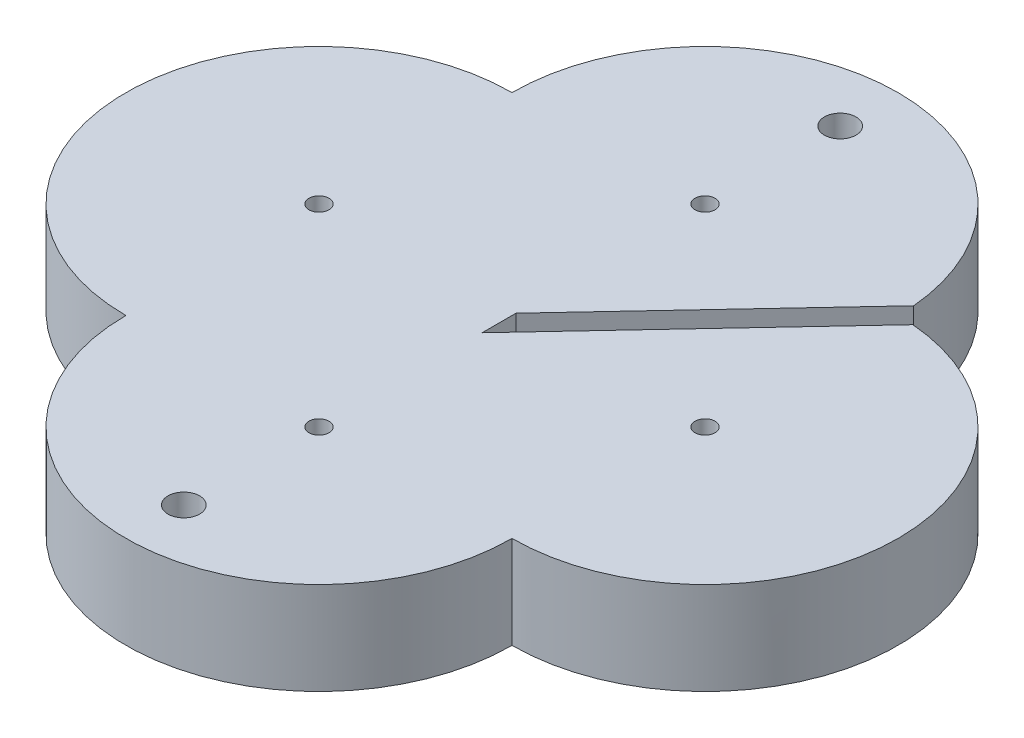
ISO-10303-21;
HEADER;
FILE_DESCRIPTION(('STEP AP214'),'2;1');
FILE_NAME('part.step','',(''),(''),'','','');
FILE_SCHEMA(('AUTOMOTIVE_DESIGN { 1 0 10303 214 1 1 1 1 }'));
ENDSEC;
DATA;
#1=APPLICATION_CONTEXT('core data for automotive mechanical design processes');
#2=APPLICATION_PROTOCOL_DEFINITION('international standard','automotive_design',2000,#1);
#3=PRODUCT_CONTEXT('',#1,'mechanical');
#4=PRODUCT('Part','Part','',(#3));
#5=PRODUCT_RELATED_PRODUCT_CATEGORY('part','',(#4));
#6=PRODUCT_DEFINITION_FORMATION('','',#4);
#7=PRODUCT_DEFINITION_CONTEXT('part definition',#1,'design');
#8=PRODUCT_DEFINITION('design','',#6,#7);
#9=PRODUCT_DEFINITION_SHAPE('','',#8);
#10=(LENGTH_UNIT() NAMED_UNIT(*) SI_UNIT(.MILLI.,.METRE.));
#11=(NAMED_UNIT(*) PLANE_ANGLE_UNIT() SI_UNIT($,.RADIAN.));
#12=(NAMED_UNIT(*) SI_UNIT($,.STERADIAN.) SOLID_ANGLE_UNIT());
#13=UNCERTAINTY_MEASURE_WITH_UNIT(LENGTH_MEASURE(1.E-05),#10,'distance_accuracy_value','');
#14=(GEOMETRIC_REPRESENTATION_CONTEXT(3) GLOBAL_UNCERTAINTY_ASSIGNED_CONTEXT((#13)) GLOBAL_UNIT_ASSIGNED_CONTEXT((#10,
#11,#12)) REPRESENTATION_CONTEXT('',''));
#15=CARTESIAN_POINT('',(0.,0.,0.));
#16=DIRECTION('',(0.,0.,1.));
#17=DIRECTION('',(1.,0.,0.));
#18=AXIS2_PLACEMENT_3D('',#15,#16,#17);
#19=CARTESIAN_POINT('',(0.,0.,0.));
#20=DIRECTION('',(0.,1.,0.));
#21=DIRECTION('',(0.,0.,1.));
#22=AXIS2_PLACEMENT_3D('',#19,#20,#21);
#23=PLANE('',#22);
#24=CARTESIAN_POINT('',(-30.4545454545454,0.,94.6590909090909));
#25=DIRECTION('',(0.,1.,0.));
#26=DIRECTION('',(0.,0.,1.));
#27=AXIS2_PLACEMENT_3D('',#24,#25,#26);
#28=CIRCLE('',#27,9.50000000000001);
#29=CARTESIAN_POINT('',(-30.4545454545454,0.,104.159090909091));
#30=VERTEX_POINT('',#29);
#31=EDGE_CURVE('E179',#30,#30,#28,.T.);
#32=ORIENTED_EDGE('',*,*,#31,.T.);
#33=EDGE_LOOP('',(#32));
#34=FACE_BOUND('',#33,.T.);
#35=CARTESIAN_POINT('',(-30.4545454545454,0.,-75.3409090909091));
#36=DIRECTION('',(0.,1.,0.));
#37=DIRECTION('',(0.,0.,1.));
#38=AXIS2_PLACEMENT_3D('',#35,#36,#37);
#39=CIRCLE('',#38,9.5);
#40=CARTESIAN_POINT('',(-30.4545454545454,0.,-65.8409090909091));
#41=VERTEX_POINT('',#40);
#42=EDGE_CURVE('E197',#41,#41,#39,.T.);
#43=ORIENTED_EDGE('',*,*,#42,.T.);
#44=EDGE_LOOP('',(#43));
#45=FACE_BOUND('',#44,.T.);
#46=CARTESIAN_POINT('',(54.5454545454546,0.,9.65909090909088));
#47=DIRECTION('',(0.,1.,0.));
#48=DIRECTION('',(0.,0.,1.));
#49=AXIS2_PLACEMENT_3D('',#46,#47,#48);
#50=CIRCLE('',#49,4.00000000000001);
#51=CARTESIAN_POINT('',(54.5454545454546,0.,13.6590909090909));
#52=VERTEX_POINT('',#51);
#53=EDGE_CURVE('E200',#52,#52,#50,.T.);
#54=ORIENTED_EDGE('',*,*,#53,.T.);
#55=EDGE_LOOP('',(#54));
#56=FACE_BOUND('',#55,.T.);
#57=CARTESIAN_POINT('',(-115.454545454545,0.,9.65909090909088));
#58=DIRECTION('',(0.,1.,0.));
#59=DIRECTION('',(0.,0.,1.));
#60=AXIS2_PLACEMENT_3D('',#57,#58,#59);
#61=CIRCLE('',#60,4.00000000000001);
#62=CARTESIAN_POINT('',(-115.454545454545,0.,13.6590909090909));
#63=VERTEX_POINT('',#62);
#64=EDGE_CURVE('E203',#63,#63,#61,.T.);
#65=ORIENTED_EDGE('',*,*,#64,.T.);
#66=EDGE_LOOP('',(#65));
#67=FACE_BOUND('',#66,.T.);
#68=DIRECTION('',(1.,0.,0.));
#69=VECTOR('',#68,1.);
#70=CARTESIAN_POINT('',(0.,0.,-25.3409090909091));
#71=LINE('',#70,#69);
#72=CARTESIAN_POINT('',(-65.4545454545455,0.,-25.3409090909091));
#73=VERTEX_POINT('',#72);
#74=CARTESIAN_POINT('',(4.54545454545455,0.,-25.3409090909091));
#75=VERTEX_POINT('',#74);
#76=EDGE_CURVE('E206',#73,#75,#71,.T.);
#77=ORIENTED_EDGE('',*,*,#76,.F.);
#78=DIRECTION('',(0.,0.,1.));
#79=VECTOR('',#78,1.);
#80=CARTESIAN_POINT('',(-65.4545454545455,0.,0.));
#81=LINE('',#80,#79);
#82=CARTESIAN_POINT('',(-65.4545454545454,0.,44.6590909090909));
#83=VERTEX_POINT('',#82);
#84=EDGE_CURVE('E215',#73,#83,#81,.T.);
#85=ORIENTED_EDGE('',*,*,#84,.T.);
#86=DIRECTION('',(1.,0.,0.));
#87=VECTOR('',#86,1.);
#88=CARTESIAN_POINT('',(0.,0.,44.6590909090909));
#89=LINE('',#88,#87);
#90=CARTESIAN_POINT('',(4.54545454545456,0.,44.6590909090909));
#91=VERTEX_POINT('',#90);
#92=EDGE_CURVE('E212',#83,#91,#89,.T.);
#93=ORIENTED_EDGE('',*,*,#92,.T.);
#94=DIRECTION('',(0.,0.,1.));
#95=VECTOR('',#94,1.);
#96=CARTESIAN_POINT('',(4.54545454545455,0.,0.));
#97=LINE('',#96,#95);
#98=EDGE_CURVE('E209',#75,#91,#97,.T.);
#99=ORIENTED_EDGE('',*,*,#98,.F.);
#100=EDGE_LOOP('',(#77,#85,#93,#99));
#101=FACE_BOUND('',#100,.T.);
#102=CARTESIAN_POINT('',(-30.4545454545454,0.,-40.3409090909091));
#103=DIRECTION('',(0.,1.,0.));
#104=DIRECTION('',(0.,0.,1.));
#105=AXIS2_PLACEMENT_3D('',#102,#103,#104);
#106=CIRCLE('',#105,50.);
#107=CARTESIAN_POINT('',(19.5454545454546,0.,-40.3409090909091));
#108=VERTEX_POINT('',#107);
#109=CARTESIAN_POINT('',(-80.4545454545454,0.,-40.3409090909091));
#110=VERTEX_POINT('',#109);
#111=EDGE_CURVE('E218',#108,#110,#106,.T.);
#112=ORIENTED_EDGE('',*,*,#111,.F.);
#113=CARTESIAN_POINT('',(19.5454545454546,0.,9.65909090909088));
#114=DIRECTION('',(0.,1.,0.));
#115=DIRECTION('',(0.,0.,1.));
#116=AXIS2_PLACEMENT_3D('',#113,#114,#115);
#117=CIRCLE('',#116,50.);
#118=CARTESIAN_POINT('',(19.5454545454546,0.,59.6590909090909));
#119=VERTEX_POINT('',#118);
#120=EDGE_CURVE('E185',#119,#108,#117,.T.);
#121=ORIENTED_EDGE('',*,*,#120,.F.);
#122=CARTESIAN_POINT('',(-30.4545454545454,0.,59.6590909090909));
#123=DIRECTION('',(0.,1.,0.));
#124=DIRECTION('',(0.,0.,1.));
#125=AXIS2_PLACEMENT_3D('',#122,#123,#124);
#126=CIRCLE('',#125,50.);
#127=CARTESIAN_POINT('',(-80.4545454545454,0.,59.6590909090909));
#128=VERTEX_POINT('',#127);
#129=EDGE_CURVE('E223',#128,#119,#126,.T.);
#130=ORIENTED_EDGE('',*,*,#129,.F.);
#131=CARTESIAN_POINT('',(-80.4545454545454,0.,9.65909090909088));
#132=DIRECTION('',(0.,1.,0.));
#133=DIRECTION('',(0.,0.,1.));
#134=AXIS2_PLACEMENT_3D('',#131,#132,#133);
#135=CIRCLE('',#134,50.);
#136=EDGE_CURVE('E221',#110,#128,#135,.T.);
#137=ORIENTED_EDGE('',*,*,#136,.F.);
#138=EDGE_LOOP('',(#112,#121,#130,#137));
#139=FACE_BOUND('',#138,.T.);
#140=CARTESIAN_POINT('',(-30.4545454545454,0.,-40.3409090909091));
#141=DIRECTION('',(0.,-1.,0.));
#142=DIRECTION('',(0.,0.,-1.));
#143=AXIS2_PLACEMENT_3D('',#140,#141,#142);
#144=CIRCLE('',#143,2.59999999999999);
#145=CARTESIAN_POINT('',(-30.4545454545454,0.,-42.9409090909091));
#146=VERTEX_POINT('',#145);
#147=EDGE_CURVE('E280',#146,#146,#144,.T.);
#148=ORIENTED_EDGE('',*,*,#147,.F.);
#149=EDGE_LOOP('',(#148));
#150=FACE_BOUND('',#149,.T.);
#151=CARTESIAN_POINT('',(19.5454545454546,0.,9.65909090909088));
#152=DIRECTION('',(0.,-1.,0.));
#153=DIRECTION('',(0.,0.,-1.));
#154=AXIS2_PLACEMENT_3D('',#151,#152,#153);
#155=CIRCLE('',#154,2.59999999999999);
#156=CARTESIAN_POINT('',(19.5454545454546,0.,7.05909090909089));
#157=VERTEX_POINT('',#156);
#158=EDGE_CURVE('E274',#157,#157,#155,.T.);
#159=ORIENTED_EDGE('',*,*,#158,.F.);
#160=EDGE_LOOP('',(#159));
#161=FACE_BOUND('',#160,.T.);
#162=CARTESIAN_POINT('',(-30.4545454545454,0.,59.6590909090909));
#163=DIRECTION('',(0.,-1.,0.));
#164=DIRECTION('',(0.,0.,-1.));
#165=AXIS2_PLACEMENT_3D('',#162,#163,#164);
#166=CIRCLE('',#165,2.59999999999999);
#167=CARTESIAN_POINT('',(-30.4545454545454,0.,57.0590909090909));
#168=VERTEX_POINT('',#167);
#169=EDGE_CURVE('E268',#168,#168,#166,.T.);
#170=ORIENTED_EDGE('',*,*,#169,.F.);
#171=EDGE_LOOP('',(#170));
#172=FACE_BOUND('',#171,.T.);
#173=CARTESIAN_POINT('',(-80.4545454545454,0.,9.65909090909088));
#174=DIRECTION('',(0.,-1.,0.));
#175=DIRECTION('',(0.,0.,-1.));
#176=AXIS2_PLACEMENT_3D('',#173,#174,#175);
#177=CIRCLE('',#176,2.59999999999999);
#178=CARTESIAN_POINT('',(-80.4545454545454,0.,7.05909090909089));
#179=VERTEX_POINT('',#178);
#180=EDGE_CURVE('E262',#179,#179,#177,.T.);
#181=ORIENTED_EDGE('',*,*,#180,.F.);
#182=EDGE_LOOP('',(#181));
#183=FACE_BOUND('',#182,.T.);
#184=ADVANCED_FACE('F32',(#34,#45,#56,#67,#101,#139,#150,#161,#172,#183),#23,.F.);
#185=CARTESIAN_POINT('',(-5.45454545454544,12.,-15.3409090909091));
#186=DIRECTION('',(0.,1.,0.));
#187=DIRECTION('',(0.,0.,1.));
#188=AXIS2_PLACEMENT_3D('',#185,#186,#187);
#189=PLANE('',#188);
#190=DIRECTION('',(-0.683783245191358,0.,0.729685188006153));
#191=VECTOR('',#190,1.);
#192=CARTESIAN_POINT('',(-7.53210899378822,12.,-7.05829036352056));
#193=LINE('',#192,#191);
#194=CARTESIAN_POINT('',(4.54545454545455,12.,-19.9466132110954));
#195=VERTEX_POINT('',#194);
#196=CARTESIAN_POINT('',(-30.4545454545454,12.,17.4029149614883));
#197=VERTEX_POINT('',#196);
#198=EDGE_CURVE('E131',#195,#197,#193,.T.);
#199=ORIENTED_EDGE('',*,*,#198,.F.);
#200=DIRECTION('',(0.,0.,1.));
#201=VECTOR('',#200,1.);
#202=CARTESIAN_POINT('',(4.54545454545455,12.,0.));
#203=LINE('',#202,#201);
#204=CARTESIAN_POINT('',(4.54545454545456,12.,44.6590909090909));
#205=VERTEX_POINT('',#204);
#206=EDGE_CURVE('E184',#195,#205,#203,.T.);
#207=ORIENTED_EDGE('',*,*,#206,.T.);
#208=DIRECTION('',(1.,0.,0.));
#209=VECTOR('',#208,1.);
#210=CARTESIAN_POINT('',(0.,12.,44.6590909090909));
#211=LINE('',#210,#209);
#212=CARTESIAN_POINT('',(-65.4545454545454,12.,44.6590909090909));
#213=VERTEX_POINT('',#212);
#214=EDGE_CURVE('E188',#213,#205,#211,.T.);
#215=ORIENTED_EDGE('',*,*,#214,.F.);
#216=DIRECTION('',(0.,0.,1.));
#217=VECTOR('',#216,1.);
#218=CARTESIAN_POINT('',(-65.4545454545455,12.,0.));
#219=LINE('',#218,#217);
#220=CARTESIAN_POINT('',(-65.4545454545455,12.,-25.3409090909091));
#221=VERTEX_POINT('',#220);
#222=EDGE_CURVE('E191',#221,#213,#219,.T.);
#223=ORIENTED_EDGE('',*,*,#222,.F.);
#224=DIRECTION('',(1.,0.,0.));
#225=VECTOR('',#224,1.);
#226=CARTESIAN_POINT('',(0.,12.,-25.3409090909091));
#227=LINE('',#226,#225);
#228=CARTESIAN_POINT('',(1.37769001388408,12.,-25.3409090909091));
#229=VERTEX_POINT('',#228);
#230=EDGE_CURVE('E182',#221,#229,#227,.T.);
#231=ORIENTED_EDGE('',*,*,#230,.T.);
#232=DIRECTION('',(-0.683783245191364,0.,0.729685188006148));
#233=VECTOR('',#232,1.);
#234=CARTESIAN_POINT('',(-11.9102201218249,12.,-11.1609898346687));
#235=LINE('',#234,#233);
#236=CARTESIAN_POINT('',(-30.4545454545454,12.,8.62820449264542));
#237=VERTEX_POINT('',#236);
#238=EDGE_CURVE('E149',#229,#237,#235,.T.);
#239=ORIENTED_EDGE('',*,*,#238,.T.);
#240=DIRECTION('',(0.,0.,1.));
#241=VECTOR('',#240,1.);
#242=CARTESIAN_POINT('',(-30.4545454545454,12.,0.));
#243=LINE('',#242,#241);
#244=EDGE_CURVE('E49',#237,#197,#243,.T.);
#245=ORIENTED_EDGE('',*,*,#244,.T.);
#246=EDGE_LOOP('',(#199,#207,#215,#223,#231,#239,#245));
#247=FACE_BOUND('',#246,.T.);
#248=ADVANCED_FACE('F147',(#247),#189,.F.);
#249=CARTESIAN_POINT('',(19.5454545454546,12.,9.65909090909088));
#250=DIRECTION('',(0.,-1.,0.));
#251=DIRECTION('',(0.,0.,-1.));
#252=AXIS2_PLACEMENT_3D('',#249,#250,#251);
#253=CYLINDRICAL_SURFACE('',#252,50.);
#254=DIRECTION('',(0.,-1.,0.));
#255=VECTOR('',#254,1.);
#256=CARTESIAN_POINT('',(23.5093444340854,12.,-40.1835372013008));
#257=LINE('',#256,#255);
#258=CARTESIAN_POINT('',(23.5093444340854,24.,-40.1835372013009));
#259=VERTEX_POINT('',#258);
#260=CARTESIAN_POINT('',(23.5093444340854,12.,-40.1835372013008));
#261=VERTEX_POINT('',#260);
#262=EDGE_CURVE('E159',#259,#261,#257,.T.);
#263=ORIENTED_EDGE('',*,*,#262,.F.);
#264=CARTESIAN_POINT('',(19.5454545454546,24.,9.65909090909088));
#265=DIRECTION('',(0.,1.,0.));
#266=DIRECTION('',(0.,0.,1.));
#267=AXIS2_PLACEMENT_3D('',#264,#265,#266);
#268=CIRCLE('',#267,50.);
#269=CARTESIAN_POINT('',(19.5454545454546,24.,59.6590909090909));
#270=VERTEX_POINT('',#269);
#271=EDGE_CURVE('E164',#270,#259,#268,.T.);
#272=ORIENTED_EDGE('',*,*,#271,.F.);
#273=DIRECTION('',(0.,-1.,0.));
#274=VECTOR('',#273,1.);
#275=CARTESIAN_POINT('',(19.5454545454546,12.,59.6590909090909));
#276=LINE('',#275,#274);
#277=EDGE_CURVE('E229',#270,#119,#276,.T.);
#278=ORIENTED_EDGE('',*,*,#277,.T.);
#279=ORIENTED_EDGE('',*,*,#120,.T.);
#280=DIRECTION('',(0.,-1.,0.));
#281=VECTOR('',#280,1.);
#282=CARTESIAN_POINT('',(19.5454545454546,12.,-40.3409090909091));
#283=LINE('',#282,#281);
#284=CARTESIAN_POINT('',(19.5454545454546,12.,-40.3409090909091));
#285=VERTEX_POINT('',#284);
#286=EDGE_CURVE('E227',#285,#108,#283,.T.);
#287=ORIENTED_EDGE('',*,*,#286,.F.);
#288=CARTESIAN_POINT('',(19.5454545454546,12.,9.65909090909088));
#289=DIRECTION('',(0.,1.,0.));
#290=DIRECTION('',(0.,0.,1.));
#291=AXIS2_PLACEMENT_3D('',#288,#289,#290);
#292=CIRCLE('',#291,50.);
#293=EDGE_CURVE('E11',#261,#285,#292,.T.);
#294=ORIENTED_EDGE('',*,*,#293,.F.);
#295=EDGE_LOOP('',(#263,#272,#278,#279,#287,#294));
#296=FACE_BOUND('',#295,.T.);
#297=ADVANCED_FACE('F315',(#296),#253,.T.);
#298=CARTESIAN_POINT('',(-5.45454545454544,24.,-15.3409090909091));
#299=DIRECTION('',(0.,1.,0.));
#300=DIRECTION('',(0.,0.,1.));
#301=AXIS2_PLACEMENT_3D('',#298,#299,#300);
#302=PLANE('',#301);
#303=CARTESIAN_POINT('',(-30.4545454545454,24.,94.6590909090909));
#304=DIRECTION('',(0.,1.,0.));
#305=DIRECTION('',(0.,0.,1.));
#306=AXIS2_PLACEMENT_3D('',#303,#304,#305);
#307=CIRCLE('',#306,4.1);
#308=CARTESIAN_POINT('',(-30.4545454545454,24.,98.7590909090909));
#309=VERTEX_POINT('',#308);
#310=EDGE_CURVE('E250',#309,#309,#307,.T.);
#311=ORIENTED_EDGE('',*,*,#310,.F.);
#312=EDGE_LOOP('',(#311));
#313=FACE_BOUND('',#312,.T.);
#314=CARTESIAN_POINT('',(-30.4545454545454,24.,-75.3409090909091));
#315=DIRECTION('',(0.,1.,0.));
#316=DIRECTION('',(0.,0.,1.));
#317=AXIS2_PLACEMENT_3D('',#314,#315,#316);
#318=CIRCLE('',#317,4.1);
#319=CARTESIAN_POINT('',(-30.4545454545454,24.,-71.240909090909));
#320=VERTEX_POINT('',#319);
#321=EDGE_CURVE('E258',#320,#320,#318,.T.);
#322=ORIENTED_EDGE('',*,*,#321,.F.);
#323=EDGE_LOOP('',(#322));
#324=FACE_BOUND('',#323,.T.);
#325=CARTESIAN_POINT('',(-80.4545454545454,24.,9.65909090909088));
#326=DIRECTION('',(0.,1.,0.));
#327=DIRECTION('',(0.,0.,1.));
#328=AXIS2_PLACEMENT_3D('',#325,#326,#327);
#329=CIRCLE('',#328,2.59999999999999);
#330=CARTESIAN_POINT('',(-80.4545454545454,24.,12.2590909090909));
#331=VERTEX_POINT('',#330);
#332=EDGE_CURVE('E265',#331,#331,#329,.T.);
#333=ORIENTED_EDGE('',*,*,#332,.F.);
#334=EDGE_LOOP('',(#333));
#335=FACE_BOUND('',#334,.T.);
#336=CARTESIAN_POINT('',(-30.4545454545454,24.,59.6590909090909));
#337=DIRECTION('',(0.,1.,0.));
#338=DIRECTION('',(0.,0.,1.));
#339=AXIS2_PLACEMENT_3D('',#336,#337,#338);
#340=CIRCLE('',#339,2.59999999999999);
#341=CARTESIAN_POINT('',(-30.4545454545454,24.,62.2590909090909));
#342=VERTEX_POINT('',#341);
#343=EDGE_CURVE('E271',#342,#342,#340,.T.);
#344=ORIENTED_EDGE('',*,*,#343,.F.);
#345=EDGE_LOOP('',(#344));
#346=FACE_BOUND('',#345,.T.);
#347=CARTESIAN_POINT('',(19.5454545454546,24.,9.65909090909088));
#348=DIRECTION('',(0.,1.,0.));
#349=DIRECTION('',(0.,0.,1.));
#350=AXIS2_PLACEMENT_3D('',#347,#348,#349);
#351=CIRCLE('',#350,2.59999999999999);
#352=CARTESIAN_POINT('',(19.5454545454546,24.,12.2590909090909));
#353=VERTEX_POINT('',#352);
#354=EDGE_CURVE('E277',#353,#353,#351,.T.);
#355=ORIENTED_EDGE('',*,*,#354,.F.);
#356=EDGE_LOOP('',(#355));
#357=FACE_BOUND('',#356,.T.);
#358=CARTESIAN_POINT('',(-30.4545454545454,24.,-40.3409090909091));
#359=DIRECTION('',(0.,1.,0.));
#360=DIRECTION('',(0.,0.,1.));
#361=AXIS2_PLACEMENT_3D('',#358,#359,#360);
#362=CIRCLE('',#361,2.59999999999999);
#363=CARTESIAN_POINT('',(-30.4545454545454,24.,-37.7409090909091));
#364=VERTEX_POINT('',#363);
#365=EDGE_CURVE('E283',#364,#364,#362,.T.);
#366=ORIENTED_EDGE('',*,*,#365,.F.);
#367=EDGE_LOOP('',(#366));
#368=FACE_BOUND('',#367,.T.);
#369=ORIENTED_EDGE('',*,*,#271,.T.);
#370=DIRECTION('',(-0.683783245191358,0.,0.729685188006153));
#371=VECTOR('',#370,1.);
#372=CARTESIAN_POINT('',(-2.42814069621081,24.,-12.5048848698732));
#373=LINE('',#372,#371);
#374=CARTESIAN_POINT('',(-30.4545454545454,24.,17.4029149614883));
#375=VERTEX_POINT('',#374);
#376=EDGE_CURVE('E41',#259,#375,#373,.T.);
#377=ORIENTED_EDGE('',*,*,#376,.T.);
#378=DIRECTION('',(0.,0.,1.));
#379=VECTOR('',#378,1.);
#380=CARTESIAN_POINT('',(-30.4545454545454,24.,0.));
#381=LINE('',#380,#379);
#382=CARTESIAN_POINT('',(-30.4545454545454,24.,8.62820449264542));
#383=VERTEX_POINT('',#382);
#384=EDGE_CURVE('E139',#383,#375,#381,.T.);
#385=ORIENTED_EDGE('',*,*,#384,.F.);
#386=DIRECTION('',(-0.683783245191364,0.,0.729685188006148));
#387=VECTOR('',#386,1.);
#388=CARTESIAN_POINT('',(-6.80625182424754,24.,-16.6075843410212));
#389=LINE('',#388,#387);
#390=CARTESIAN_POINT('',(19.3688365879261,24.,-44.5397901144592));
#391=VERTEX_POINT('',#390);
#392=EDGE_CURVE('E239',#391,#383,#389,.T.);
#393=ORIENTED_EDGE('',*,*,#392,.F.);
#394=CARTESIAN_POINT('',(-30.4545454545454,24.,-40.3409090909091));
#395=DIRECTION('',(0.,1.,0.));
#396=DIRECTION('',(0.,0.,1.));
#397=AXIS2_PLACEMENT_3D('',#394,#395,#396);
#398=CIRCLE('',#397,50.);
#399=CARTESIAN_POINT('',(-80.4545454545454,24.,-40.3409090909091));
#400=VERTEX_POINT('',#399);
#401=EDGE_CURVE('E167',#391,#400,#398,.T.);
#402=ORIENTED_EDGE('',*,*,#401,.T.);
#403=CARTESIAN_POINT('',(-80.4545454545454,24.,9.65909090909088));
#404=DIRECTION('',(0.,1.,0.));
#405=DIRECTION('',(0.,0.,1.));
#406=AXIS2_PLACEMENT_3D('',#403,#404,#405);
#407=CIRCLE('',#406,50.);
#408=CARTESIAN_POINT('',(-80.4545454545454,24.,59.6590909090909));
#409=VERTEX_POINT('',#408);
#410=EDGE_CURVE('E169',#400,#409,#407,.T.);
#411=ORIENTED_EDGE('',*,*,#410,.T.);
#412=CARTESIAN_POINT('',(-30.4545454545454,24.,59.6590909090909));
#413=DIRECTION('',(0.,1.,0.));
#414=DIRECTION('',(0.,0.,1.));
#415=AXIS2_PLACEMENT_3D('',#412,#413,#414);
#416=CIRCLE('',#415,50.);
#417=EDGE_CURVE('E172',#409,#270,#416,.T.);
#418=ORIENTED_EDGE('',*,*,#417,.T.);
#419=EDGE_LOOP('',(#369,#377,#385,#393,#402,#411,#418));
#420=FACE_BOUND('',#419,.T.);
#421=ADVANCED_FACE('F324',(#313,#324,#335,#346,#357,#368,#420),#302,.T.);
#422=CARTESIAN_POINT('',(-30.4545454545454,12.,-40.3409090909091));
#423=DIRECTION('',(0.,-1.,0.));
#424=DIRECTION('',(0.,0.,-1.));
#425=AXIS2_PLACEMENT_3D('',#422,#423,#424);
#426=CYLINDRICAL_SURFACE('',#425,50.);
#427=ORIENTED_EDGE('',*,*,#401,.F.);
#428=DIRECTION('',(0.,-1.,0.));
#429=VECTOR('',#428,1.);
#430=CARTESIAN_POINT('',(19.3688365879261,12.,-44.5397901144592));
#431=LINE('',#430,#429);
#432=CARTESIAN_POINT('',(19.3688365879261,12.,-44.5397901144592));
#433=VERTEX_POINT('',#432);
#434=EDGE_CURVE('E57',#391,#433,#431,.T.);
#435=ORIENTED_EDGE('',*,*,#434,.T.);
#436=CARTESIAN_POINT('',(-30.4545454545454,12.,-40.3409090909091));
#437=DIRECTION('',(0.,1.,0.));
#438=DIRECTION('',(0.,0.,1.));
#439=AXIS2_PLACEMENT_3D('',#436,#437,#438);
#440=CIRCLE('',#439,50.);
#441=EDGE_CURVE('E161',#285,#433,#440,.T.);
#442=ORIENTED_EDGE('',*,*,#441,.F.);
#443=ORIENTED_EDGE('',*,*,#286,.T.);
#444=ORIENTED_EDGE('',*,*,#111,.T.);
#445=DIRECTION('',(0.,-1.,0.));
#446=VECTOR('',#445,1.);
#447=CARTESIAN_POINT('',(-80.4545454545454,12.,-40.3409090909091));
#448=LINE('',#447,#446);
#449=EDGE_CURVE('E236',#400,#110,#448,.T.);
#450=ORIENTED_EDGE('',*,*,#449,.F.);
#451=EDGE_LOOP('',(#427,#435,#442,#443,#444,#450));
#452=FACE_BOUND('',#451,.T.);
#453=ADVANCED_FACE('F334',(#452),#426,.T.);
#454=CARTESIAN_POINT('',(-80.4545454545454,12.,9.65909090909088));
#455=DIRECTION('',(0.,-1.,0.));
#456=DIRECTION('',(0.,0.,-1.));
#457=AXIS2_PLACEMENT_3D('',#454,#455,#456);
#458=CYLINDRICAL_SURFACE('',#457,50.);
#459=ORIENTED_EDGE('',*,*,#136,.T.);
#460=DIRECTION('',(0.,-1.,0.));
#461=VECTOR('',#460,1.);
#462=CARTESIAN_POINT('',(-80.4545454545454,12.,59.6590909090909));
#463=LINE('',#462,#461);
#464=EDGE_CURVE('E233',#409,#128,#463,.T.);
#465=ORIENTED_EDGE('',*,*,#464,.F.);
#466=ORIENTED_EDGE('',*,*,#410,.F.);
#467=ORIENTED_EDGE('',*,*,#449,.T.);
#468=EDGE_LOOP('',(#459,#465,#466,#467));
#469=FACE_BOUND('',#468,.T.);
#470=ADVANCED_FACE('F330',(#469),#458,.T.);
#471=CARTESIAN_POINT('',(-30.4545454545454,12.,59.6590909090909));
#472=DIRECTION('',(0.,-1.,0.));
#473=DIRECTION('',(0.,0.,-1.));
#474=AXIS2_PLACEMENT_3D('',#471,#472,#473);
#475=CYLINDRICAL_SURFACE('',#474,50.);
#476=ORIENTED_EDGE('',*,*,#129,.T.);
#477=ORIENTED_EDGE('',*,*,#277,.F.);
#478=ORIENTED_EDGE('',*,*,#417,.F.);
#479=ORIENTED_EDGE('',*,*,#464,.T.);
#480=EDGE_LOOP('',(#476,#477,#478,#479));
#481=FACE_BOUND('',#480,.T.);
#482=ADVANCED_FACE('F326',(#481),#475,.T.);
#483=CARTESIAN_POINT('',(0.,12.,-25.3409090909091));
#484=DIRECTION('',(0.,0.,-1.));
#485=DIRECTION('',(-1.,0.,0.));
#486=AXIS2_PLACEMENT_3D('',#483,#484,#485);
#487=PLANE('',#486);
#488=ORIENTED_EDGE('',*,*,#76,.T.);
#489=DIRECTION('',(0.,-1.,0.));
#490=VECTOR('',#489,1.);
#491=CARTESIAN_POINT('',(4.54545454545455,12.,-25.3409090909091));
#492=LINE('',#491,#490);
#493=CARTESIAN_POINT('',(4.54545454545455,12.,-25.3409090909091));
#494=VERTEX_POINT('',#493);
#495=EDGE_CURVE('E230',#494,#75,#492,.T.);
#496=ORIENTED_EDGE('',*,*,#495,.F.);
#497=EDGE_CURVE('E163',#229,#494,#227,.T.);
#498=ORIENTED_EDGE('',*,*,#497,.F.);
#499=ORIENTED_EDGE('',*,*,#230,.F.);
#500=DIRECTION('',(0.,-1.,0.));
#501=VECTOR('',#500,1.);
#502=CARTESIAN_POINT('',(-65.4545454545455,12.,-25.3409090909091));
#503=LINE('',#502,#501);
#504=EDGE_CURVE('E194',#221,#73,#503,.T.);
#505=ORIENTED_EDGE('',*,*,#504,.T.);
#506=EDGE_LOOP('',(#488,#496,#498,#499,#505));
#507=FACE_BOUND('',#506,.T.);
#508=ADVANCED_FACE('F329',(#507),#487,.F.);
#509=CARTESIAN_POINT('',(4.54545454545455,12.,0.));
#510=DIRECTION('',(1.,0.,0.));
#511=DIRECTION('',(0.,0.,-1.));
#512=AXIS2_PLACEMENT_3D('',#509,#510,#511);
#513=PLANE('',#512);
#514=ORIENTED_EDGE('',*,*,#98,.T.);
#515=DIRECTION('',(0.,-1.,0.));
#516=VECTOR('',#515,1.);
#517=CARTESIAN_POINT('',(4.54545454545456,12.,44.6590909090909));
#518=LINE('',#517,#516);
#519=EDGE_CURVE('E243',#205,#91,#518,.T.);
#520=ORIENTED_EDGE('',*,*,#519,.F.);
#521=ORIENTED_EDGE('',*,*,#206,.F.);
#522=EDGE_CURVE('E186',#494,#195,#203,.T.);
#523=ORIENTED_EDGE('',*,*,#522,.F.);
#524=ORIENTED_EDGE('',*,*,#495,.T.);
#525=EDGE_LOOP('',(#514,#520,#521,#523,#524));
#526=FACE_BOUND('',#525,.T.);
#527=ADVANCED_FACE('F345',(#526),#513,.F.);
#528=CARTESIAN_POINT('',(0.,12.,44.6590909090909));
#529=DIRECTION('',(0.,0.,-1.));
#530=DIRECTION('',(-1.,0.,0.));
#531=AXIS2_PLACEMENT_3D('',#528,#529,#530);
#532=PLANE('',#531);
#533=ORIENTED_EDGE('',*,*,#92,.F.);
#534=DIRECTION('',(0.,-1.,0.));
#535=VECTOR('',#534,1.);
#536=CARTESIAN_POINT('',(-65.4545454545454,12.,44.6590909090909));
#537=LINE('',#536,#535);
#538=EDGE_CURVE('E241',#213,#83,#537,.T.);
#539=ORIENTED_EDGE('',*,*,#538,.F.);
#540=ORIENTED_EDGE('',*,*,#214,.T.);
#541=ORIENTED_EDGE('',*,*,#519,.T.);
#542=EDGE_LOOP('',(#533,#539,#540,#541));
#543=FACE_BOUND('',#542,.T.);
#544=ADVANCED_FACE('F341',(#543),#532,.T.);
#545=CARTESIAN_POINT('',(-65.4545454545455,12.,0.));
#546=DIRECTION('',(1.,0.,0.));
#547=DIRECTION('',(0.,0.,-1.));
#548=AXIS2_PLACEMENT_3D('',#545,#546,#547);
#549=PLANE('',#548);
#550=ORIENTED_EDGE('',*,*,#84,.F.);
#551=ORIENTED_EDGE('',*,*,#504,.F.);
#552=ORIENTED_EDGE('',*,*,#222,.T.);
#553=ORIENTED_EDGE('',*,*,#538,.T.);
#554=EDGE_LOOP('',(#550,#551,#552,#553));
#555=FACE_BOUND('',#554,.T.);
#556=ADVANCED_FACE('F305',(#555),#549,.T.);
#557=CARTESIAN_POINT('',(-115.454545454545,12.,9.65909090909088));
#558=DIRECTION('',(0.,-1.,0.));
#559=DIRECTION('',(0.,0.,-1.));
#560=AXIS2_PLACEMENT_3D('',#557,#558,#559);
#561=CYLINDRICAL_SURFACE('',#560,4.00000000000001);
#562=ORIENTED_EDGE('',*,*,#64,.F.);
#563=EDGE_LOOP('',(#562));
#564=FACE_BOUND('',#563,.T.);
#565=CARTESIAN_POINT('',(-115.454545454545,20.,9.65909090909088));
#566=DIRECTION('',(0.,-1.,0.));
#567=DIRECTION('',(0.,0.,-1.));
#568=AXIS2_PLACEMENT_3D('',#565,#566,#567);
#569=CIRCLE('',#568,4.00000000000001);
#570=CARTESIAN_POINT('',(-115.454545454545,20.,5.65909090909088));
#571=VERTEX_POINT('',#570);
#572=EDGE_CURVE('E156',#571,#571,#569,.T.);
#573=ORIENTED_EDGE('',*,*,#572,.F.);
#574=EDGE_LOOP('',(#573));
#575=FACE_BOUND('',#574,.T.);
#576=ADVANCED_FACE('F297',(#564,#575),#561,.F.);
#577=CARTESIAN_POINT('',(54.5454545454546,12.,9.65909090909088));
#578=DIRECTION('',(0.,-1.,0.));
#579=DIRECTION('',(0.,0.,-1.));
#580=AXIS2_PLACEMENT_3D('',#577,#578,#579);
#581=CYLINDRICAL_SURFACE('',#580,4.00000000000001);
#582=ORIENTED_EDGE('',*,*,#53,.F.);
#583=EDGE_LOOP('',(#582));
#584=FACE_BOUND('',#583,.T.);
#585=CARTESIAN_POINT('',(54.5454545454546,20.,9.65909090909088));
#586=DIRECTION('',(0.,-1.,0.));
#587=DIRECTION('',(0.,0.,-1.));
#588=AXIS2_PLACEMENT_3D('',#585,#586,#587);
#589=CIRCLE('',#588,4.00000000000001);
#590=CARTESIAN_POINT('',(54.5454545454546,20.,5.65909090909087));
#591=VERTEX_POINT('',#590);
#592=EDGE_CURVE('E286',#591,#591,#589,.T.);
#593=ORIENTED_EDGE('',*,*,#592,.F.);
#594=EDGE_LOOP('',(#593));
#595=FACE_BOUND('',#594,.T.);
#596=ADVANCED_FACE('F294',(#584,#595),#581,.F.);
#597=CARTESIAN_POINT('',(-30.4545454545454,12.,-75.3409090909091));
#598=DIRECTION('',(0.,-1.,0.));
#599=DIRECTION('',(0.,0.,-1.));
#600=AXIS2_PLACEMENT_3D('',#597,#598,#599);
#601=CYLINDRICAL_SURFACE('',#600,9.5);
#602=CARTESIAN_POINT('',(-30.4545454545454,12.,-75.3409090909091));
#603=DIRECTION('',(0.,1.,0.));
#604=DIRECTION('',(0.,0.,1.));
#605=AXIS2_PLACEMENT_3D('',#602,#603,#604);
#606=CIRCLE('',#605,9.5);
#607=CARTESIAN_POINT('',(-30.4545454545454,12.,-65.8409090909091));
#608=VERTEX_POINT('',#607);
#609=EDGE_CURVE('E175',#608,#608,#606,.T.);
#610=ORIENTED_EDGE('',*,*,#609,.T.);
#611=EDGE_LOOP('',(#610));
#612=FACE_BOUND('',#611,.T.);
#613=ORIENTED_EDGE('',*,*,#42,.F.);
#614=EDGE_LOOP('',(#613));
#615=FACE_BOUND('',#614,.T.);
#616=ADVANCED_FACE('F296',(#612,#615),#601,.F.);
#617=CARTESIAN_POINT('',(-30.4545454545454,12.,94.6590909090909));
#618=DIRECTION('',(0.,-1.,0.));
#619=DIRECTION('',(0.,0.,-1.));
#620=AXIS2_PLACEMENT_3D('',#617,#618,#619);
#621=CYLINDRICAL_SURFACE('',#620,9.50000000000001);
#622=CARTESIAN_POINT('',(-30.4545454545454,12.,94.6590909090909));
#623=DIRECTION('',(0.,1.,0.));
#624=DIRECTION('',(0.,0.,1.));
#625=AXIS2_PLACEMENT_3D('',#622,#623,#624);
#626=CIRCLE('',#625,9.50000000000001);
#627=CARTESIAN_POINT('',(-30.4545454545454,12.,104.159090909091));
#628=VERTEX_POINT('',#627);
#629=EDGE_CURVE('E176',#628,#628,#626,.T.);
#630=ORIENTED_EDGE('',*,*,#629,.T.);
#631=EDGE_LOOP('',(#630));
#632=FACE_BOUND('',#631,.T.);
#633=ORIENTED_EDGE('',*,*,#31,.F.);
#634=EDGE_LOOP('',(#633));
#635=FACE_BOUND('',#634,.T.);
#636=ADVANCED_FACE('F34',(#632,#635),#621,.F.);
#637=CARTESIAN_POINT('',(-30.4545454545454,12.,-75.3409090909091));
#638=DIRECTION('',(0.,1.,0.));
#639=DIRECTION('',(0.,0.,1.));
#640=AXIS2_PLACEMENT_3D('',#637,#638,#639);
#641=CIRCLE('',#640,4.1);
#642=CARTESIAN_POINT('',(-30.4545454545454,12.,-71.240909090909));
#643=VERTEX_POINT('',#642);
#644=EDGE_CURVE('E36',#643,#643,#641,.T.);
#645=ORIENTED_EDGE('',*,*,#644,.T.);
#646=EDGE_LOOP('',(#645));
#647=FACE_BOUND('',#646,.T.);
#648=ORIENTED_EDGE('',*,*,#609,.F.);
#649=EDGE_LOOP('',(#648));
#650=FACE_BOUND('',#649,.T.);
#651=ADVANCED_FACE('F318',(#647,#650),#189,.F.);
#652=CARTESIAN_POINT('',(-30.4545454545454,12.,94.6590909090909));
#653=DIRECTION('',(0.,1.,0.));
#654=DIRECTION('',(0.,0.,1.));
#655=AXIS2_PLACEMENT_3D('',#652,#653,#654);
#656=CIRCLE('',#655,4.1);
#657=CARTESIAN_POINT('',(-30.4545454545454,12.,98.7590909090909));
#658=VERTEX_POINT('',#657);
#659=EDGE_CURVE('E248',#658,#658,#656,.T.);
#660=ORIENTED_EDGE('',*,*,#659,.T.);
#661=EDGE_LOOP('',(#660));
#662=FACE_BOUND('',#661,.T.);
#663=ORIENTED_EDGE('',*,*,#629,.F.);
#664=EDGE_LOOP('',(#663));
#665=FACE_BOUND('',#664,.T.);
#666=ADVANCED_FACE('F317',(#662,#665),#189,.F.);
#667=CARTESIAN_POINT('',(0.,12.,0.));
#668=DIRECTION('',(0.,1.,0.));
#669=DIRECTION('',(0.,0.,1.));
#670=AXIS2_PLACEMENT_3D('',#667,#668,#669);
#671=PLANE('',#670);
#672=ORIENTED_EDGE('',*,*,#497,.T.);
#673=ORIENTED_EDGE('',*,*,#522,.T.);
#674=EDGE_CURVE('E136',#261,#195,#193,.T.);
#675=ORIENTED_EDGE('',*,*,#674,.F.);
#676=ORIENTED_EDGE('',*,*,#293,.T.);
#677=ORIENTED_EDGE('',*,*,#441,.T.);
#678=EDGE_CURVE('E150',#433,#229,#235,.T.);
#679=ORIENTED_EDGE('',*,*,#678,.T.);
#680=EDGE_LOOP('',(#672,#673,#675,#676,#677,#679));
#681=FACE_BOUND('',#680,.T.);
#682=ADVANCED_FACE('F367',(#681),#671,.T.);
#683=CARTESIAN_POINT('',(-7.53210899378822,12.,-7.05829036352056));
#684=DIRECTION('',(-0.729685188006153,0.,-0.683783245191358));
#685=DIRECTION('',(-0.683783245191358,0.,0.729685188006153));
#686=AXIS2_PLACEMENT_3D('',#683,#684,#685);
#687=PLANE('',#686);
#688=ORIENTED_EDGE('',*,*,#262,.T.);
#689=ORIENTED_EDGE('',*,*,#674,.T.);
#690=ORIENTED_EDGE('',*,*,#198,.T.);
#691=DIRECTION('',(0.,1.,0.));
#692=VECTOR('',#691,1.);
#693=CARTESIAN_POINT('',(-30.4545454545454,12.,17.4029149614883));
#694=LINE('',#693,#692);
#695=EDGE_CURVE('E133',#197,#375,#694,.T.);
#696=ORIENTED_EDGE('',*,*,#695,.T.);
#697=ORIENTED_EDGE('',*,*,#376,.F.);
#698=EDGE_LOOP('',(#688,#689,#690,#696,#697));
#699=FACE_BOUND('',#698,.T.);
#700=ADVANCED_FACE('F132',(#699),#687,.T.);
#701=CARTESIAN_POINT('',(-11.9102201218249,12.,-11.1609898346687));
#702=DIRECTION('',(-0.729685188006148,0.,-0.683783245191363));
#703=DIRECTION('',(-0.683783245191364,0.,0.729685188006148));
#704=AXIS2_PLACEMENT_3D('',#701,#702,#703);
#705=PLANE('',#704);
#706=ORIENTED_EDGE('',*,*,#392,.T.);
#707=DIRECTION('',(0.,1.,0.));
#708=VECTOR('',#707,1.);
#709=CARTESIAN_POINT('',(-30.4545454545454,12.,8.62820449264542));
#710=LINE('',#709,#708);
#711=EDGE_CURVE('E144',#237,#383,#710,.T.);
#712=ORIENTED_EDGE('',*,*,#711,.F.);
#713=ORIENTED_EDGE('',*,*,#238,.F.);
#714=ORIENTED_EDGE('',*,*,#678,.F.);
#715=ORIENTED_EDGE('',*,*,#434,.F.);
#716=EDGE_LOOP('',(#706,#712,#713,#714,#715));
#717=FACE_BOUND('',#716,.T.);
#718=ADVANCED_FACE('F370',(#717),#705,.F.);
#719=CARTESIAN_POINT('',(-30.4545454545454,12.,0.));
#720=DIRECTION('',(-1.,0.,0.));
#721=DIRECTION('',(0.,0.,1.));
#722=AXIS2_PLACEMENT_3D('',#719,#720,#721);
#723=PLANE('',#722);
#724=ORIENTED_EDGE('',*,*,#384,.T.);
#725=ORIENTED_EDGE('',*,*,#695,.F.);
#726=ORIENTED_EDGE('',*,*,#244,.F.);
#727=ORIENTED_EDGE('',*,*,#711,.T.);
#728=EDGE_LOOP('',(#724,#725,#726,#727));
#729=FACE_BOUND('',#728,.T.);
#730=ADVANCED_FACE('F141',(#729),#723,.F.);
#731=CARTESIAN_POINT('',(54.5454545454546,20.,9.65909090909088));
#732=DIRECTION('',(0.,-1.,0.));
#733=DIRECTION('',(0.,0.,-1.));
#734=AXIS2_PLACEMENT_3D('',#731,#732,#733);
#735=PLANE('',#734);
#736=ORIENTED_EDGE('',*,*,#592,.T.);
#737=EDGE_LOOP('',(#736));
#738=FACE_BOUND('',#737,.T.);
#739=ADVANCED_FACE('F292',(#738),#735,.T.);
#740=CARTESIAN_POINT('',(-115.454545454545,20.,9.65909090909088));
#741=DIRECTION('',(0.,-1.,0.));
#742=DIRECTION('',(0.,0.,-1.));
#743=AXIS2_PLACEMENT_3D('',#740,#741,#742);
#744=PLANE('',#743);
#745=ORIENTED_EDGE('',*,*,#572,.T.);
#746=EDGE_LOOP('',(#745));
#747=FACE_BOUND('',#746,.T.);
#748=ADVANCED_FACE('F411',(#747),#744,.T.);
#749=CARTESIAN_POINT('',(-30.4545454545454,0.,-40.3409090909091));
#750=DIRECTION('',(0.,-1.,0.));
#751=DIRECTION('',(0.,0.,-1.));
#752=AXIS2_PLACEMENT_3D('',#749,#750,#751);
#753=CYLINDRICAL_SURFACE('',#752,2.59999999999999);
#754=ORIENTED_EDGE('',*,*,#147,.T.);
#755=EDGE_LOOP('',(#754));
#756=FACE_BOUND('',#755,.T.);
#757=ORIENTED_EDGE('',*,*,#365,.T.);
#758=EDGE_LOOP('',(#757));
#759=FACE_BOUND('',#758,.T.);
#760=ADVANCED_FACE('F408',(#756,#759),#753,.F.);
#761=CARTESIAN_POINT('',(19.5454545454546,0.,9.65909090909088));
#762=DIRECTION('',(0.,-1.,0.));
#763=DIRECTION('',(0.,0.,-1.));
#764=AXIS2_PLACEMENT_3D('',#761,#762,#763);
#765=CYLINDRICAL_SURFACE('',#764,2.59999999999999);
#766=ORIENTED_EDGE('',*,*,#158,.T.);
#767=EDGE_LOOP('',(#766));
#768=FACE_BOUND('',#767,.T.);
#769=ORIENTED_EDGE('',*,*,#354,.T.);
#770=EDGE_LOOP('',(#769));
#771=FACE_BOUND('',#770,.T.);
#772=ADVANCED_FACE('F410',(#768,#771),#765,.F.);
#773=CARTESIAN_POINT('',(-30.4545454545454,0.,59.6590909090909));
#774=DIRECTION('',(0.,-1.,0.));
#775=DIRECTION('',(0.,0.,-1.));
#776=AXIS2_PLACEMENT_3D('',#773,#774,#775);
#777=CYLINDRICAL_SURFACE('',#776,2.59999999999999);
#778=ORIENTED_EDGE('',*,*,#169,.T.);
#779=EDGE_LOOP('',(#778));
#780=FACE_BOUND('',#779,.T.);
#781=ORIENTED_EDGE('',*,*,#343,.T.);
#782=EDGE_LOOP('',(#781));
#783=FACE_BOUND('',#782,.T.);
#784=ADVANCED_FACE('F395',(#780,#783),#777,.F.);
#785=CARTESIAN_POINT('',(-80.4545454545454,0.,9.65909090909088));
#786=DIRECTION('',(0.,-1.,0.));
#787=DIRECTION('',(0.,0.,-1.));
#788=AXIS2_PLACEMENT_3D('',#785,#786,#787);
#789=CYLINDRICAL_SURFACE('',#788,2.59999999999999);
#790=ORIENTED_EDGE('',*,*,#180,.T.);
#791=EDGE_LOOP('',(#790));
#792=FACE_BOUND('',#791,.T.);
#793=ORIENTED_EDGE('',*,*,#332,.T.);
#794=EDGE_LOOP('',(#793));
#795=FACE_BOUND('',#794,.T.);
#796=ADVANCED_FACE('F391',(#792,#795),#789,.F.);
#797=CARTESIAN_POINT('',(-30.4545454545454,50.,94.6590909090909));
#798=DIRECTION('',(0.,-1.,0.));
#799=DIRECTION('',(0.,0.,-1.));
#800=AXIS2_PLACEMENT_3D('',#797,#798,#799);
#801=CYLINDRICAL_SURFACE('',#800,4.1);
#802=ORIENTED_EDGE('',*,*,#310,.T.);
#803=EDGE_LOOP('',(#802));
#804=FACE_BOUND('',#803,.T.);
#805=ORIENTED_EDGE('',*,*,#659,.F.);
#806=EDGE_LOOP('',(#805));
#807=FACE_BOUND('',#806,.T.);
#808=ADVANCED_FACE('F394',(#804,#807),#801,.F.);
#809=CARTESIAN_POINT('',(-30.4545454545454,50.,-75.3409090909091));
#810=DIRECTION('',(0.,-1.,0.));
#811=DIRECTION('',(0.,0.,-1.));
#812=AXIS2_PLACEMENT_3D('',#809,#810,#811);
#813=CYLINDRICAL_SURFACE('',#812,4.1);
#814=ORIENTED_EDGE('',*,*,#321,.T.);
#815=EDGE_LOOP('',(#814));
#816=FACE_BOUND('',#815,.T.);
#817=ORIENTED_EDGE('',*,*,#644,.F.);
#818=EDGE_LOOP('',(#817));
#819=FACE_BOUND('',#818,.T.);
#820=ADVANCED_FACE('F507',(#816,#819),#813,.F.);
#821=CLOSED_SHELL('',(#184,#248,#297,#421,#453,#470,#482,#508,#527,#544,#556,#576,#596,#616,
#636,#651,#666,#682,#700,#718,#730,#739,#748,#760,#772,#784,#796,#808,#820));
#822=MANIFOLD_SOLID_BREP('B2',#821);
#823=ADVANCED_BREP_SHAPE_REPRESENTATION('',(#18,#822),#14);
#824=SHAPE_DEFINITION_REPRESENTATION(#9,#823);
ENDSEC;
END-ISO-10303-21;
